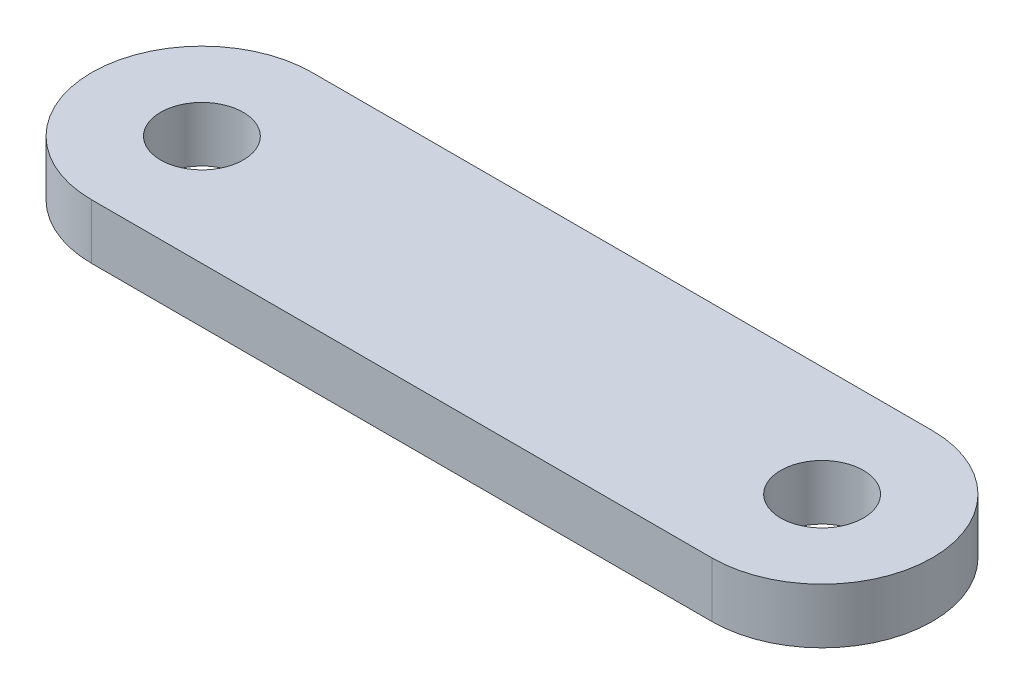
ISO-10303-21;
HEADER;
FILE_DESCRIPTION(('STEP AP214'),'2;1');
FILE_NAME('part.step','',(''),(''),'','','');
FILE_SCHEMA(('AUTOMOTIVE_DESIGN { 1 0 10303 214 1 1 1 1 }'));
ENDSEC;
DATA;
#1=APPLICATION_CONTEXT('core data for automotive mechanical design processes');
#2=APPLICATION_PROTOCOL_DEFINITION('international standard','automotive_design',2000,#1);
#3=PRODUCT_CONTEXT('',#1,'mechanical');
#4=PRODUCT('Part','Part','',(#3));
#5=PRODUCT_RELATED_PRODUCT_CATEGORY('part','',(#4));
#6=PRODUCT_DEFINITION_FORMATION('','',#4);
#7=PRODUCT_DEFINITION_CONTEXT('part definition',#1,'design');
#8=PRODUCT_DEFINITION('design','',#6,#7);
#9=PRODUCT_DEFINITION_SHAPE('','',#8);
#10=(LENGTH_UNIT() NAMED_UNIT(*) SI_UNIT(.MILLI.,.METRE.));
#11=(NAMED_UNIT(*) PLANE_ANGLE_UNIT() SI_UNIT($,.RADIAN.));
#12=(NAMED_UNIT(*) SI_UNIT($,.STERADIAN.) SOLID_ANGLE_UNIT());
#13=UNCERTAINTY_MEASURE_WITH_UNIT(LENGTH_MEASURE(1.E-05),#10,'distance_accuracy_value','');
#14=(GEOMETRIC_REPRESENTATION_CONTEXT(3) GLOBAL_UNCERTAINTY_ASSIGNED_CONTEXT((#13)) GLOBAL_UNIT_ASSIGNED_CONTEXT((#10,
#11,#12)) REPRESENTATION_CONTEXT('',''));
#15=CARTESIAN_POINT('',(0.,0.,0.));
#16=DIRECTION('',(0.,0.,1.));
#17=DIRECTION('',(1.,0.,0.));
#18=AXIS2_PLACEMENT_3D('',#15,#16,#17);
#19=CARTESIAN_POINT('',(-14.2875,2.54,0.));
#20=DIRECTION('',(0.,1.,0.));
#21=DIRECTION('',(0.,0.,1.));
#22=AXIS2_PLACEMENT_3D('',#19,#20,#21);
#23=PLANE('',#22);
#24=CARTESIAN_POINT('',(-14.2875,2.54,0.));
#25=DIRECTION('',(0.,1.,0.));
#26=DIRECTION('',(0.,0.,1.));
#27=AXIS2_PLACEMENT_3D('',#24,#25,#26);
#28=CIRCLE('',#27,1.905);
#29=CARTESIAN_POINT('',(-14.2875,2.54,1.905));
#30=VERTEX_POINT('',#29);
#31=EDGE_CURVE('E100',#30,#30,#28,.T.);
#32=ORIENTED_EDGE('',*,*,#31,.F.);
#33=EDGE_LOOP('',(#32));
#34=FACE_BOUND('',#33,.T.);
#35=CARTESIAN_POINT('',(-14.2875,2.54,0.));
#36=DIRECTION('',(0.,1.,0.));
#37=DIRECTION('',(0.,0.,1.));
#38=AXIS2_PLACEMENT_3D('',#35,#36,#37);
#39=CIRCLE('',#38,5.08);
#40=CARTESIAN_POINT('',(-14.2875,2.54,-5.08));
#41=VERTEX_POINT('',#40);
#42=CARTESIAN_POINT('',(-14.2875,2.54,5.08));
#43=VERTEX_POINT('',#42);
#44=EDGE_CURVE('E85',#41,#43,#39,.T.);
#45=ORIENTED_EDGE('',*,*,#44,.T.);
#46=DIRECTION('',(1.,0.,0.));
#47=VECTOR('',#46,1.);
#48=CARTESIAN_POINT('',(-14.2875,2.54,5.08));
#49=LINE('',#48,#47);
#50=CARTESIAN_POINT('',(14.2875,2.54,5.08));
#51=VERTEX_POINT('',#50);
#52=EDGE_CURVE('E80',#43,#51,#49,.T.);
#53=ORIENTED_EDGE('',*,*,#52,.T.);
#54=CARTESIAN_POINT('',(14.2875,2.54,0.));
#55=DIRECTION('',(0.,1.,0.));
#56=DIRECTION('',(0.,0.,1.));
#57=AXIS2_PLACEMENT_3D('',#54,#55,#56);
#58=CIRCLE('',#57,5.08);
#59=CARTESIAN_POINT('',(14.2875,2.54,-5.08000000000001));
#60=VERTEX_POINT('',#59);
#61=EDGE_CURVE('E83',#51,#60,#58,.T.);
#62=ORIENTED_EDGE('',*,*,#61,.T.);
#63=DIRECTION('',(-1.,0.,0.));
#64=VECTOR('',#63,1.);
#65=CARTESIAN_POINT('',(-14.2875,2.54,-5.08));
#66=LINE('',#65,#64);
#67=EDGE_CURVE('E50',#60,#41,#66,.T.);
#68=ORIENTED_EDGE('',*,*,#67,.T.);
#69=EDGE_LOOP('',(#45,#53,#62,#68));
#70=FACE_BOUND('',#69,.T.);
#71=CARTESIAN_POINT('',(14.2875,2.54,0.));
#72=DIRECTION('',(0.,1.,0.));
#73=DIRECTION('',(0.,0.,1.));
#74=AXIS2_PLACEMENT_3D('',#71,#72,#73);
#75=CIRCLE('',#74,1.905);
#76=CARTESIAN_POINT('',(14.2875,2.54,1.90499999999999));
#77=VERTEX_POINT('',#76);
#78=EDGE_CURVE('E115',#77,#77,#75,.T.);
#79=ORIENTED_EDGE('',*,*,#78,.F.);
#80=EDGE_LOOP('',(#79));
#81=FACE_BOUND('',#80,.T.);
#82=ADVANCED_FACE('F33',(#34,#70,#81),#23,.T.);
#83=CARTESIAN_POINT('',(-14.2875,0.,0.));
#84=DIRECTION('',(0.,1.,0.));
#85=DIRECTION('',(0.,0.,1.));
#86=AXIS2_PLACEMENT_3D('',#83,#84,#85);
#87=PLANE('',#86);
#88=CARTESIAN_POINT('',(-14.2875,0.,0.));
#89=DIRECTION('',(0.,1.,0.));
#90=DIRECTION('',(0.,0.,1.));
#91=AXIS2_PLACEMENT_3D('',#88,#89,#90);
#92=CIRCLE('',#91,5.08);
#93=CARTESIAN_POINT('',(-14.2875,0.,-5.08));
#94=VERTEX_POINT('',#93);
#95=CARTESIAN_POINT('',(-14.2875,0.,5.08));
#96=VERTEX_POINT('',#95);
#97=EDGE_CURVE('E97',#94,#96,#92,.T.);
#98=ORIENTED_EDGE('',*,*,#97,.F.);
#99=DIRECTION('',(-1.,0.,0.));
#100=VECTOR('',#99,1.);
#101=CARTESIAN_POINT('',(-14.2875,0.,-5.08));
#102=LINE('',#101,#100);
#103=CARTESIAN_POINT('',(14.2875,0.,-5.08000000000001));
#104=VERTEX_POINT('',#103);
#105=EDGE_CURVE('E73',#104,#94,#102,.T.);
#106=ORIENTED_EDGE('',*,*,#105,.F.);
#107=CARTESIAN_POINT('',(14.2875,0.,0.));
#108=DIRECTION('',(0.,1.,0.));
#109=DIRECTION('',(0.,0.,1.));
#110=AXIS2_PLACEMENT_3D('',#107,#108,#109);
#111=CIRCLE('',#110,5.08);
#112=CARTESIAN_POINT('',(14.2875,0.,5.08));
#113=VERTEX_POINT('',#112);
#114=EDGE_CURVE('E67',#113,#104,#111,.T.);
#115=ORIENTED_EDGE('',*,*,#114,.F.);
#116=DIRECTION('',(1.,0.,0.));
#117=VECTOR('',#116,1.);
#118=CARTESIAN_POINT('',(-14.2875,0.,5.08));
#119=LINE('',#118,#117);
#120=EDGE_CURVE('E89',#96,#113,#119,.T.);
#121=ORIENTED_EDGE('',*,*,#120,.F.);
#122=EDGE_LOOP('',(#98,#106,#115,#121));
#123=FACE_BOUND('',#122,.T.);
#124=CARTESIAN_POINT('',(-14.2875,0.,0.));
#125=DIRECTION('',(0.,1.,0.));
#126=DIRECTION('',(0.,0.,1.));
#127=AXIS2_PLACEMENT_3D('',#124,#125,#126);
#128=CIRCLE('',#127,1.905);
#129=CARTESIAN_POINT('',(-14.2875,0.,1.905));
#130=VERTEX_POINT('',#129);
#131=EDGE_CURVE('E112',#130,#130,#128,.T.);
#132=ORIENTED_EDGE('',*,*,#131,.T.);
#133=EDGE_LOOP('',(#132));
#134=FACE_BOUND('',#133,.T.);
#135=CARTESIAN_POINT('',(14.2875,0.,0.));
#136=DIRECTION('',(0.,1.,0.));
#137=DIRECTION('',(0.,0.,1.));
#138=AXIS2_PLACEMENT_3D('',#135,#136,#137);
#139=CIRCLE('',#138,1.905);
#140=CARTESIAN_POINT('',(14.2875,0.,1.90499999999999));
#141=VERTEX_POINT('',#140);
#142=EDGE_CURVE('E118',#141,#141,#139,.T.);
#143=ORIENTED_EDGE('',*,*,#142,.T.);
#144=EDGE_LOOP('',(#143));
#145=FACE_BOUND('',#144,.T.);
#146=ADVANCED_FACE('F108',(#123,#134,#145),#87,.F.);
#147=CARTESIAN_POINT('',(-14.2875,2.54,0.));
#148=DIRECTION('',(0.,-1.,0.));
#149=DIRECTION('',(0.,0.,-1.));
#150=AXIS2_PLACEMENT_3D('',#147,#148,#149);
#151=CYLINDRICAL_SURFACE('',#150,5.08);
#152=ORIENTED_EDGE('',*,*,#97,.T.);
#153=DIRECTION('',(0.,-1.,0.));
#154=VECTOR('',#153,1.);
#155=CARTESIAN_POINT('',(-14.2875,2.54,5.08));
#156=LINE('',#155,#154);
#157=EDGE_CURVE('E11',#43,#96,#156,.T.);
#158=ORIENTED_EDGE('',*,*,#157,.F.);
#159=ORIENTED_EDGE('',*,*,#44,.F.);
#160=DIRECTION('',(0.,-1.,0.));
#161=VECTOR('',#160,1.);
#162=CARTESIAN_POINT('',(-14.2875,2.54,-5.08));
#163=LINE('',#162,#161);
#164=EDGE_CURVE('E93',#41,#94,#163,.T.);
#165=ORIENTED_EDGE('',*,*,#164,.T.);
#166=EDGE_LOOP('',(#152,#158,#159,#165));
#167=FACE_BOUND('',#166,.T.);
#168=ADVANCED_FACE('F35',(#167),#151,.T.);
#169=CARTESIAN_POINT('',(-14.2875,2.54,5.08));
#170=DIRECTION('',(0.,0.,-1.));
#171=DIRECTION('',(-1.,0.,0.));
#172=AXIS2_PLACEMENT_3D('',#169,#170,#171);
#173=PLANE('',#172);
#174=ORIENTED_EDGE('',*,*,#120,.T.);
#175=DIRECTION('',(0.,-1.,0.));
#176=VECTOR('',#175,1.);
#177=CARTESIAN_POINT('',(14.2875,2.54,5.08));
#178=LINE('',#177,#176);
#179=EDGE_CURVE('E42',#51,#113,#178,.T.);
#180=ORIENTED_EDGE('',*,*,#179,.F.);
#181=ORIENTED_EDGE('',*,*,#52,.F.);
#182=ORIENTED_EDGE('',*,*,#157,.T.);
#183=EDGE_LOOP('',(#174,#180,#181,#182));
#184=FACE_BOUND('',#183,.T.);
#185=ADVANCED_FACE('F88',(#184),#173,.F.);
#186=CARTESIAN_POINT('',(14.2875,2.54,0.));
#187=DIRECTION('',(0.,-1.,0.));
#188=DIRECTION('',(0.,0.,-1.));
#189=AXIS2_PLACEMENT_3D('',#186,#187,#188);
#190=CYLINDRICAL_SURFACE('',#189,5.08);
#191=ORIENTED_EDGE('',*,*,#114,.T.);
#192=DIRECTION('',(0.,-1.,0.));
#193=VECTOR('',#192,1.);
#194=CARTESIAN_POINT('',(14.2875,2.54,-5.08000000000001));
#195=LINE('',#194,#193);
#196=EDGE_CURVE('E90',#60,#104,#195,.T.);
#197=ORIENTED_EDGE('',*,*,#196,.F.);
#198=ORIENTED_EDGE('',*,*,#61,.F.);
#199=ORIENTED_EDGE('',*,*,#179,.T.);
#200=EDGE_LOOP('',(#191,#197,#198,#199));
#201=FACE_BOUND('',#200,.T.);
#202=ADVANCED_FACE('F91',(#201),#190,.T.);
#203=CARTESIAN_POINT('',(-14.2875,2.54,-5.08));
#204=DIRECTION('',(0.,0.,1.));
#205=DIRECTION('',(1.,0.,0.));
#206=AXIS2_PLACEMENT_3D('',#203,#204,#205);
#207=PLANE('',#206);
#208=ORIENTED_EDGE('',*,*,#105,.T.);
#209=ORIENTED_EDGE('',*,*,#164,.F.);
#210=ORIENTED_EDGE('',*,*,#67,.F.);
#211=ORIENTED_EDGE('',*,*,#196,.T.);
#212=EDGE_LOOP('',(#208,#209,#210,#211));
#213=FACE_BOUND('',#212,.T.);
#214=ADVANCED_FACE('F105',(#213),#207,.F.);
#215=CARTESIAN_POINT('',(-14.2875,2.54,0.));
#216=DIRECTION('',(0.,-1.,0.));
#217=DIRECTION('',(0.,0.,-1.));
#218=AXIS2_PLACEMENT_3D('',#215,#216,#217);
#219=CYLINDRICAL_SURFACE('',#218,1.905);
#220=ORIENTED_EDGE('',*,*,#31,.T.);
#221=EDGE_LOOP('',(#220));
#222=FACE_BOUND('',#221,.T.);
#223=ORIENTED_EDGE('',*,*,#131,.F.);
#224=EDGE_LOOP('',(#223));
#225=FACE_BOUND('',#224,.T.);
#226=ADVANCED_FACE('F135',(#222,#225),#219,.F.);
#227=CARTESIAN_POINT('',(14.2875,2.54,0.));
#228=DIRECTION('',(0.,-1.,0.));
#229=DIRECTION('',(0.,0.,-1.));
#230=AXIS2_PLACEMENT_3D('',#227,#228,#229);
#231=CYLINDRICAL_SURFACE('',#230,1.905);
#232=ORIENTED_EDGE('',*,*,#78,.T.);
#233=EDGE_LOOP('',(#232));
#234=FACE_BOUND('',#233,.T.);
#235=ORIENTED_EDGE('',*,*,#142,.F.);
#236=EDGE_LOOP('',(#235));
#237=FACE_BOUND('',#236,.T.);
#238=ADVANCED_FACE('F124',(#234,#237),#231,.F.);
#239=CLOSED_SHELL('',(#82,#146,#168,#185,#202,#214,#226,#238));
#240=MANIFOLD_SOLID_BREP('B2',#239);
#241=ADVANCED_BREP_SHAPE_REPRESENTATION('',(#18,#240),#14);
#242=SHAPE_DEFINITION_REPRESENTATION(#9,#241);
ENDSEC;
END-ISO-10303-21;
